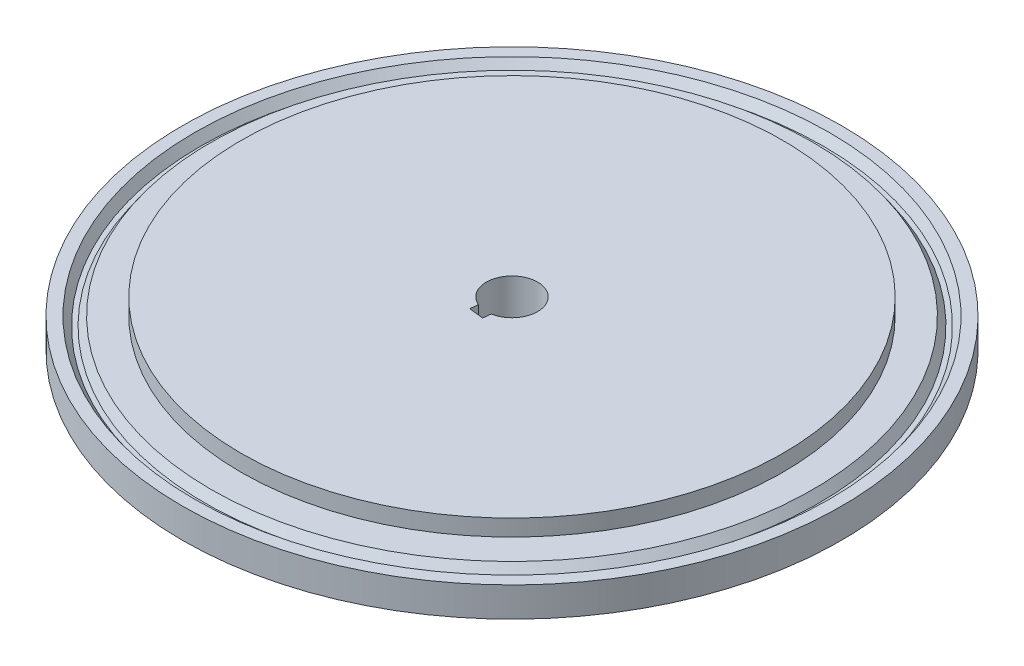
ISO-10303-21;
HEADER;
FILE_DESCRIPTION(('STEP AP214'),'2;1');
FILE_NAME('part.step','',(''),(''),'','','');
FILE_SCHEMA(('AUTOMOTIVE_DESIGN { 1 0 10303 214 1 1 1 1 }'));
ENDSEC;
DATA;
#1=APPLICATION_CONTEXT('core data for automotive mechanical design processes');
#2=APPLICATION_PROTOCOL_DEFINITION('international standard','automotive_design',2000,#1);
#3=PRODUCT_CONTEXT('',#1,'mechanical');
#4=PRODUCT('Part','Part','',(#3));
#5=PRODUCT_RELATED_PRODUCT_CATEGORY('part','',(#4));
#6=PRODUCT_DEFINITION_FORMATION('','',#4);
#7=PRODUCT_DEFINITION_CONTEXT('part definition',#1,'design');
#8=PRODUCT_DEFINITION('design','',#6,#7);
#9=PRODUCT_DEFINITION_SHAPE('','',#8);
#10=(LENGTH_UNIT() NAMED_UNIT(*) SI_UNIT(.MILLI.,.METRE.));
#11=(NAMED_UNIT(*) PLANE_ANGLE_UNIT() SI_UNIT($,.RADIAN.));
#12=(NAMED_UNIT(*) SI_UNIT($,.STERADIAN.) SOLID_ANGLE_UNIT());
#13=UNCERTAINTY_MEASURE_WITH_UNIT(LENGTH_MEASURE(1.E-05),#10,'distance_accuracy_value','');
#14=(GEOMETRIC_REPRESENTATION_CONTEXT(3) GLOBAL_UNCERTAINTY_ASSIGNED_CONTEXT((#13)) GLOBAL_UNIT_ASSIGNED_CONTEXT((#10,
#11,#12)) REPRESENTATION_CONTEXT('',''));
#15=CARTESIAN_POINT('',(0.,0.,0.));
#16=DIRECTION('',(0.,0.,1.));
#17=DIRECTION('',(1.,0.,0.));
#18=AXIS2_PLACEMENT_3D('',#15,#16,#17);
#19=CARTESIAN_POINT('',(0.,12.6,0.));
#20=DIRECTION('',(0.,-1.,0.));
#21=DIRECTION('',(0.,0.,-1.));
#22=AXIS2_PLACEMENT_3D('',#19,#20,#21);
#23=CYLINDRICAL_SURFACE('',#22,90.);
#24=CARTESIAN_POINT('',(0.,0.,0.));
#25=DIRECTION('',(0.,1.,0.));
#26=DIRECTION('',(0.,0.,1.));
#27=AXIS2_PLACEMENT_3D('',#24,#25,#26);
#28=CIRCLE('',#27,90.);
#29=CARTESIAN_POINT('',(0.,0.,90.));
#30=VERTEX_POINT('',#29);
#31=EDGE_CURVE('E11',#30,#30,#28,.T.);
#32=ORIENTED_EDGE('',*,*,#31,.T.);
#33=EDGE_LOOP('',(#32));
#34=FACE_BOUND('',#33,.T.);
#35=CARTESIAN_POINT('',(0.,8.1,0.));
#36=DIRECTION('',(0.,1.,0.));
#37=DIRECTION('',(0.,0.,1.));
#38=AXIS2_PLACEMENT_3D('',#35,#36,#37);
#39=CIRCLE('',#38,90.);
#40=CARTESIAN_POINT('',(0.,8.1,90.));
#41=VERTEX_POINT('',#40);
#42=EDGE_CURVE('E125',#41,#41,#39,.T.);
#43=ORIENTED_EDGE('',*,*,#42,.F.);
#44=EDGE_LOOP('',(#43));
#45=FACE_BOUND('',#44,.T.);
#46=ADVANCED_FACE('F31',(#34,#45),#23,.T.);
#47=CARTESIAN_POINT('',(0.,12.6,0.));
#48=DIRECTION('',(0.,1.,0.));
#49=DIRECTION('',(0.,0.,1.));
#50=AXIS2_PLACEMENT_3D('',#47,#48,#49);
#51=PLANE('',#50);
#52=CARTESIAN_POINT('',(0.,12.6,0.));
#53=DIRECTION('',(0.,1.,0.));
#54=DIRECTION('',(0.,0.,1.));
#55=AXIS2_PLACEMENT_3D('',#52,#53,#54);
#56=CIRCLE('',#55,7.00000000000003);
#57=CARTESIAN_POINT('',(1.23356864848454,12.6,6.8904505215172));
#58=VERTEX_POINT('',#57);
#59=CARTESIAN_POINT('',(-2.74109948066671,12.6,6.44099166565903));
#60=VERTEX_POINT('',#59);
#61=EDGE_CURVE('E39',#58,#60,#56,.T.);
#62=ORIENTED_EDGE('',*,*,#61,.F.);
#63=DIRECTION('',(0.112364713964542,0.,-0.993667032287812));
#64=VECTOR('',#63,1.);
#65=CARTESIAN_POINT('',(1.98733406457565,12.6,0.224729427929087));
#66=LINE('',#65,#64);
#67=CARTESIAN_POINT('',(0.992906345989446,12.6,9.01868266367626));
#68=VERTEX_POINT('',#67);
#69=EDGE_CURVE('E98',#68,#58,#66,.T.);
#70=ORIENTED_EDGE('',*,*,#69,.F.);
#71=DIRECTION('',(0.993667032287812,0.,0.112364713964542));
#72=VECTOR('',#71,1.);
#73=CARTESIAN_POINT('',(-0.994427718586202,12.6,8.79395323574717));
#74=LINE('',#73,#72);
#75=CARTESIAN_POINT('',(-2.9817617831618,12.6,8.56922380781809));
#76=VERTEX_POINT('',#75);
#77=EDGE_CURVE('E79',#76,#68,#74,.T.);
#78=ORIENTED_EDGE('',*,*,#77,.F.);
#79=DIRECTION('',(-0.112364713964542,0.,0.993667032287812));
#80=VECTOR('',#79,1.);
#81=CARTESIAN_POINT('',(-1.9873340645756,12.6,-0.224729427929082));
#82=LINE('',#81,#80);
#83=EDGE_CURVE('E103',#60,#76,#82,.T.);
#84=ORIENTED_EDGE('',*,*,#83,.F.);
#85=EDGE_LOOP('',(#62,#70,#78,#84));
#86=FACE_BOUND('',#85,.T.);
#87=CARTESIAN_POINT('',(0.,12.6,0.));
#88=DIRECTION('',(0.,1.,0.));
#89=DIRECTION('',(0.,0.,1.));
#90=AXIS2_PLACEMENT_3D('',#87,#88,#89);
#91=CIRCLE('',#90,74.);
#92=CARTESIAN_POINT('',(0.,12.6,74.));
#93=VERTEX_POINT('',#92);
#94=EDGE_CURVE('E131',#93,#93,#91,.T.);
#95=ORIENTED_EDGE('',*,*,#94,.T.);
#96=EDGE_LOOP('',(#95));
#97=FACE_BOUND('',#96,.T.);
#98=ADVANCED_FACE('F161',(#86,#97),#51,.T.);
#99=CARTESIAN_POINT('',(0.,0.,0.));
#100=DIRECTION('',(0.,1.,0.));
#101=DIRECTION('',(0.,0.,1.));
#102=AXIS2_PLACEMENT_3D('',#99,#100,#101);
#103=PLANE('',#102);
#104=CARTESIAN_POINT('',(0.,0.,0.));
#105=DIRECTION('',(0.,1.,0.));
#106=DIRECTION('',(0.,0.,1.));
#107=AXIS2_PLACEMENT_3D('',#104,#105,#106);
#108=CIRCLE('',#107,63.6238804949366);
#109=CARTESIAN_POINT('',(0.,0.,63.6238804949366));
#110=VERTEX_POINT('',#109);
#111=EDGE_CURVE('E108',#110,#110,#108,.F.);
#112=ORIENTED_EDGE('',*,*,#111,.T.);
#113=EDGE_LOOP('',(#112));
#114=FACE_BOUND('',#113,.T.);
#115=DIRECTION('',(-0.112364713964542,0.,0.993667032287812));
#116=VECTOR('',#115,1.);
#117=CARTESIAN_POINT('',(0.992906345989446,0.,9.01868266367626));
#118=LINE('',#117,#116);
#119=CARTESIAN_POINT('',(1.23356864848454,0.,6.8904505215172));
#120=VERTEX_POINT('',#119);
#121=CARTESIAN_POINT('',(0.992906345989446,0.,9.01868266367626));
#122=VERTEX_POINT('',#121);
#123=EDGE_CURVE('E85',#120,#122,#118,.T.);
#124=ORIENTED_EDGE('',*,*,#123,.F.);
#125=CARTESIAN_POINT('',(0.,0.,0.));
#126=DIRECTION('',(0.,-1.,0.));
#127=DIRECTION('',(0.,0.,-1.));
#128=AXIS2_PLACEMENT_3D('',#125,#126,#127);
#129=CIRCLE('',#128,7.00000000000003);
#130=CARTESIAN_POINT('',(-2.74109948066671,0.,6.44099166565903));
#131=VERTEX_POINT('',#130);
#132=EDGE_CURVE('E55',#131,#120,#129,.T.);
#133=ORIENTED_EDGE('',*,*,#132,.F.);
#134=DIRECTION('',(0.112364713964542,0.,-0.993667032287812));
#135=VECTOR('',#134,1.);
#136=CARTESIAN_POINT('',(-2.74109948066671,0.,6.44099166565903));
#137=LINE('',#136,#135);
#138=CARTESIAN_POINT('',(-2.9817617831618,0.,8.56922380781809));
#139=VERTEX_POINT('',#138);
#140=EDGE_CURVE('E91',#139,#131,#137,.T.);
#141=ORIENTED_EDGE('',*,*,#140,.F.);
#142=DIRECTION('',(-0.993667032287812,0.,-0.112364713964542));
#143=VECTOR('',#142,1.);
#144=CARTESIAN_POINT('',(-2.9817617831618,0.,8.56922380781809));
#145=LINE('',#144,#143);
#146=EDGE_CURVE('E76',#122,#139,#145,.T.);
#147=ORIENTED_EDGE('',*,*,#146,.F.);
#148=EDGE_LOOP('',(#124,#133,#141,#147));
#149=FACE_BOUND('',#148,.T.);
#150=ADVANCED_FACE('F89',(#114,#149),#103,.F.);
#151=CARTESIAN_POINT('',(0.,0.,0.));
#152=DIRECTION('',(0.,1.,0.));
#153=DIRECTION('',(0.,0.,1.));
#154=AXIS2_PLACEMENT_3D('',#151,#152,#153);
#155=CIRCLE('',#154,77.640556445342);
#156=CARTESIAN_POINT('',(0.,0.,77.640556445342));
#157=VERTEX_POINT('',#156);
#158=EDGE_CURVE('E106',#157,#157,#155,.T.);
#159=ORIENTED_EDGE('',*,*,#158,.T.);
#160=EDGE_LOOP('',(#159));
#161=FACE_BOUND('',#160,.T.);
#162=ORIENTED_EDGE('',*,*,#31,.F.);
#163=EDGE_LOOP('',(#162));
#164=FACE_BOUND('',#163,.T.);
#165=ADVANCED_FACE('F210',(#161,#164),#103,.F.);
#166=CARTESIAN_POINT('',(0.,32.,0.));
#167=DIRECTION('',(0.,-1.,0.));
#168=DIRECTION('',(0.,0.,-1.));
#169=AXIS2_PLACEMENT_3D('',#166,#167,#168);
#170=CYLINDRICAL_SURFACE('',#169,7.00000000000003);
#171=ORIENTED_EDGE('',*,*,#61,.T.);
#172=DIRECTION('',(0.,-1.,0.));
#173=VECTOR('',#172,1.);
#174=CARTESIAN_POINT('',(-2.74109948066671,32.,6.44099166565903));
#175=LINE('',#174,#173);
#176=EDGE_CURVE('E96',#60,#131,#175,.T.);
#177=ORIENTED_EDGE('',*,*,#176,.T.);
#178=ORIENTED_EDGE('',*,*,#132,.T.);
#179=DIRECTION('',(0.,-1.,0.));
#180=VECTOR('',#179,1.);
#181=CARTESIAN_POINT('',(1.23356864848454,32.,6.8904505215172));
#182=LINE('',#181,#180);
#183=EDGE_CURVE('E82',#58,#120,#182,.T.);
#184=ORIENTED_EDGE('',*,*,#183,.F.);
#185=EDGE_LOOP('',(#171,#177,#178,#184));
#186=FACE_BOUND('',#185,.T.);
#187=ADVANCED_FACE('F203',(#186),#170,.F.);
#188=CARTESIAN_POINT('',(-2.74109948066671,32.,6.44099166565903));
#189=DIRECTION('',(-0.993667032287812,0.,-0.112364713964542));
#190=DIRECTION('',(-0.112364713964542,0.,0.993667032287812));
#191=AXIS2_PLACEMENT_3D('',#188,#189,#190);
#192=PLANE('',#191);
#193=ORIENTED_EDGE('',*,*,#83,.T.);
#194=DIRECTION('',(0.,-1.,0.));
#195=VECTOR('',#194,1.);
#196=CARTESIAN_POINT('',(-2.9817617831618,32.,8.56922380781809));
#197=LINE('',#196,#195);
#198=EDGE_CURVE('E81',#76,#139,#197,.T.);
#199=ORIENTED_EDGE('',*,*,#198,.T.);
#200=ORIENTED_EDGE('',*,*,#140,.T.);
#201=ORIENTED_EDGE('',*,*,#176,.F.);
#202=EDGE_LOOP('',(#193,#199,#200,#201));
#203=FACE_BOUND('',#202,.T.);
#204=ADVANCED_FACE('F200',(#203),#192,.F.);
#205=CARTESIAN_POINT('',(-2.9817617831618,32.,8.56922380781809));
#206=DIRECTION('',(-0.112364713964542,0.,0.993667032287812));
#207=DIRECTION('',(0.993667032287812,0.,0.112364713964542));
#208=AXIS2_PLACEMENT_3D('',#205,#206,#207);
#209=PLANE('',#208);
#210=ORIENTED_EDGE('',*,*,#77,.T.);
#211=DIRECTION('',(0.,-1.,0.));
#212=VECTOR('',#211,1.);
#213=CARTESIAN_POINT('',(0.992906345989446,32.,9.01868266367626));
#214=LINE('',#213,#212);
#215=EDGE_CURVE('E47',#68,#122,#214,.T.);
#216=ORIENTED_EDGE('',*,*,#215,.T.);
#217=ORIENTED_EDGE('',*,*,#146,.T.);
#218=ORIENTED_EDGE('',*,*,#198,.F.);
#219=EDGE_LOOP('',(#210,#216,#217,#218));
#220=FACE_BOUND('',#219,.T.);
#221=ADVANCED_FACE('F73',(#220),#209,.F.);
#222=CARTESIAN_POINT('',(0.992906345989446,32.,9.01868266367626));
#223=DIRECTION('',(0.993667032287812,0.,0.112364713964542));
#224=DIRECTION('',(0.112364713964542,0.,-0.993667032287812));
#225=AXIS2_PLACEMENT_3D('',#222,#223,#224);
#226=PLANE('',#225);
#227=ORIENTED_EDGE('',*,*,#69,.T.);
#228=ORIENTED_EDGE('',*,*,#183,.T.);
#229=ORIENTED_EDGE('',*,*,#123,.T.);
#230=ORIENTED_EDGE('',*,*,#215,.F.);
#231=EDGE_LOOP('',(#227,#228,#229,#230));
#232=FACE_BOUND('',#231,.T.);
#233=ADVANCED_FACE('F86',(#232),#226,.F.);
#234=CARTESIAN_POINT('',(0.,5.47840413366214,0.));
#235=DIRECTION('',(0.,1.,0.));
#236=DIRECTION('',(0.,0.,1.));
#237=AXIS2_PLACEMENT_3D('',#234,#235,#236);
#238=CONICAL_SURFACE('',#237,68.8638849919393,0.763159756218278);
#239=CARTESIAN_POINT('',(0.,5.47840413366214,0.));
#240=DIRECTION('',(0.,-1.,0.));
#241=DIRECTION('',(0.,0.,-1.));
#242=AXIS2_PLACEMENT_3D('',#239,#240,#241);
#243=CIRCLE('',#242,68.8638849919393);
#244=CARTESIAN_POINT('',(0.,5.47840413366214,-68.8638849919393));
#245=VERTEX_POINT('',#244);
#246=EDGE_CURVE('E116',#245,#245,#243,.T.);
#247=ORIENTED_EDGE('',*,*,#246,.T.);
#248=EDGE_LOOP('',(#247));
#249=FACE_BOUND('',#248,.T.);
#250=ORIENTED_EDGE('',*,*,#111,.F.);
#251=EDGE_LOOP('',(#250));
#252=FACE_BOUND('',#251,.T.);
#253=ADVANCED_FACE('F191',(#249,#252),#238,.T.);
#254=CARTESIAN_POINT('',(0.,-0.267847704786495,0.));
#255=DIRECTION('',(0.,-1.,0.));
#256=DIRECTION('',(0.,0.,-1.));
#257=AXIS2_PLACEMENT_3D('',#254,#255,#256);
#258=CONICAL_SURFACE('',#257,77.8967484208425,0.763159756218278);
#259=CARTESIAN_POINT('',(0.,5.47840413366214,0.));
#260=DIRECTION('',(0.,-1.,0.));
#261=DIRECTION('',(0.,0.,-1.));
#262=AXIS2_PLACEMENT_3D('',#259,#260,#261);
#263=CIRCLE('',#262,72.4005519483392);
#264=CARTESIAN_POINT('',(0.,5.47840413366214,-72.4005519483392));
#265=VERTEX_POINT('',#264);
#266=EDGE_CURVE('E109',#265,#265,#263,.T.);
#267=ORIENTED_EDGE('',*,*,#266,.F.);
#268=EDGE_LOOP('',(#267));
#269=FACE_BOUND('',#268,.T.);
#270=ORIENTED_EDGE('',*,*,#158,.F.);
#271=EDGE_LOOP('',(#270));
#272=FACE_BOUND('',#271,.T.);
#273=ADVANCED_FACE('F185',(#269,#272),#258,.F.);
#274=CARTESIAN_POINT('',(68.8638849919393,5.47840413366215,0.));
#275=DIRECTION('',(0.,1.,0.));
#276=DIRECTION('',(0.,0.,1.));
#277=AXIS2_PLACEMENT_3D('',#274,#275,#276);
#278=PLANE('',#277);
#279=ORIENTED_EDGE('',*,*,#246,.F.);
#280=EDGE_LOOP('',(#279));
#281=FACE_BOUND('',#280,.T.);
#282=ORIENTED_EDGE('',*,*,#266,.T.);
#283=EDGE_LOOP('',(#282));
#284=FACE_BOUND('',#283,.T.);
#285=ADVANCED_FACE('F180',(#281,#284),#278,.F.);
#286=CARTESIAN_POINT('',(0.,8.1,0.));
#287=DIRECTION('',(0.,1.,0.));
#288=DIRECTION('',(0.,0.,1.));
#289=AXIS2_PLACEMENT_3D('',#286,#287,#288);
#290=PLANE('',#289);
#291=CARTESIAN_POINT('',(0.,8.1,0.));
#292=DIRECTION('',(0.,1.,0.));
#293=DIRECTION('',(0.,0.,1.));
#294=AXIS2_PLACEMENT_3D('',#291,#292,#293);
#295=CIRCLE('',#294,74.);
#296=CARTESIAN_POINT('',(0.,8.1,74.));
#297=VERTEX_POINT('',#296);
#298=EDGE_CURVE('E134',#297,#297,#295,.T.);
#299=ORIENTED_EDGE('',*,*,#298,.F.);
#300=EDGE_LOOP('',(#299));
#301=FACE_BOUND('',#300,.T.);
#302=CARTESIAN_POINT('',(0.,8.1,0.));
#303=DIRECTION('',(0.,1.,0.));
#304=DIRECTION('',(0.,0.,1.));
#305=AXIS2_PLACEMENT_3D('',#302,#303,#304);
#306=CIRCLE('',#305,82.1564681015949);
#307=CARTESIAN_POINT('',(0.,8.1,82.1564681015949));
#308=VERTEX_POINT('',#307);
#309=EDGE_CURVE('E34',#308,#308,#306,.T.);
#310=ORIENTED_EDGE('',*,*,#309,.T.);
#311=EDGE_LOOP('',(#310));
#312=FACE_BOUND('',#311,.T.);
#313=ADVANCED_FACE('F141',(#301,#312),#290,.T.);
#314=CARTESIAN_POINT('',(0.,8.1,0.));
#315=DIRECTION('',(0.,1.,0.));
#316=DIRECTION('',(0.,0.,1.));
#317=AXIS2_PLACEMENT_3D('',#314,#315,#316);
#318=CYLINDRICAL_SURFACE('',#317,74.);
#319=ORIENTED_EDGE('',*,*,#298,.T.);
#320=EDGE_LOOP('',(#319));
#321=FACE_BOUND('',#320,.T.);
#322=ORIENTED_EDGE('',*,*,#94,.F.);
#323=EDGE_LOOP('',(#322));
#324=FACE_BOUND('',#323,.T.);
#325=ADVANCED_FACE('F173',(#321,#324),#318,.T.);
#326=CARTESIAN_POINT('',(0.,8.1,0.));
#327=DIRECTION('',(0.,1.,0.));
#328=DIRECTION('',(0.,0.,1.));
#329=AXIS2_PLACEMENT_3D('',#326,#327,#328);
#330=CIRCLE('',#329,86.709289028532);
#331=CARTESIAN_POINT('',(0.,8.1,86.709289028532));
#332=VERTEX_POINT('',#331);
#333=EDGE_CURVE('E128',#332,#332,#330,.F.);
#334=ORIENTED_EDGE('',*,*,#333,.T.);
#335=EDGE_LOOP('',(#334));
#336=FACE_BOUND('',#335,.T.);
#337=ORIENTED_EDGE('',*,*,#42,.T.);
#338=EDGE_LOOP('',(#337));
#339=FACE_BOUND('',#338,.T.);
#340=ADVANCED_FACE('F155',(#336,#339),#290,.T.);
#341=CARTESIAN_POINT('',(0.,5.70041166103368,0.));
#342=DIRECTION('',(0.,1.,0.));
#343=DIRECTION('',(0.,0.,1.));
#344=AXIS2_PLACEMENT_3D('',#341,#342,#343);
#345=CONICAL_SURFACE('',#344,85.0628425496033,0.601361256829481);
#346=CARTESIAN_POINT('',(0.,5.70041166103368,0.));
#347=DIRECTION('',(0.,-1.,0.));
#348=DIRECTION('',(0.,0.,-1.));
#349=AXIS2_PLACEMENT_3D('',#346,#347,#348);
#350=CIRCLE('',#349,85.0628425496033);
#351=CARTESIAN_POINT('',(0.,5.70041166103368,-85.0628425496033));
#352=VERTEX_POINT('',#351);
#353=EDGE_CURVE('E119',#352,#352,#350,.T.);
#354=ORIENTED_EDGE('',*,*,#353,.T.);
#355=EDGE_LOOP('',(#354));
#356=FACE_BOUND('',#355,.T.);
#357=ORIENTED_EDGE('',*,*,#333,.F.);
#358=EDGE_LOOP('',(#357));
#359=FACE_BOUND('',#358,.T.);
#360=ADVANCED_FACE('F146',(#356,#359),#345,.F.);
#361=CARTESIAN_POINT('',(0.,9.42306338805129,0.));
#362=DIRECTION('',(0.,-1.,0.));
#363=DIRECTION('',(0.,0.,-1.));
#364=AXIS2_PLACEMENT_3D('',#361,#362,#363);
#365=CONICAL_SURFACE('',#364,81.2486652833853,0.601361256829473);
#366=CARTESIAN_POINT('',(0.,5.70041166103368,0.));
#367=DIRECTION('',(0.,-1.,0.));
#368=DIRECTION('',(0.,0.,-1.));
#369=AXIS2_PLACEMENT_3D('',#366,#367,#368);
#370=CIRCLE('',#369,83.8029145805236);
#371=CARTESIAN_POINT('',(0.,5.70041166103368,-83.8029145805236));
#372=VERTEX_POINT('',#371);
#373=EDGE_CURVE('E122',#372,#372,#370,.T.);
#374=ORIENTED_EDGE('',*,*,#373,.F.);
#375=EDGE_LOOP('',(#374));
#376=FACE_BOUND('',#375,.T.);
#377=ORIENTED_EDGE('',*,*,#309,.F.);
#378=EDGE_LOOP('',(#377));
#379=FACE_BOUND('',#378,.T.);
#380=ADVANCED_FACE('F143',(#376,#379),#365,.T.);
#381=CARTESIAN_POINT('',(83.8029145805236,5.70041166103368,0.));
#382=DIRECTION('',(0.,-1.,0.));
#383=DIRECTION('',(0.,0.,-1.));
#384=AXIS2_PLACEMENT_3D('',#381,#382,#383);
#385=PLANE('',#384);
#386=ORIENTED_EDGE('',*,*,#353,.F.);
#387=EDGE_LOOP('',(#386));
#388=FACE_BOUND('',#387,.T.);
#389=ORIENTED_EDGE('',*,*,#373,.T.);
#390=EDGE_LOOP('',(#389));
#391=FACE_BOUND('',#390,.T.);
#392=ADVANCED_FACE('F145',(#388,#391),#385,.F.);
#393=CLOSED_SHELL('',(#46,#98,#150,#165,#187,#204,#221,#233,#253,#273,#285,#313,#325,#340,#360,
#380,#392));
#394=MANIFOLD_SOLID_BREP('B2',#393);
#395=ADVANCED_BREP_SHAPE_REPRESENTATION('',(#18,#394),#14);
#396=SHAPE_DEFINITION_REPRESENTATION(#9,#395);
ENDSEC;
END-ISO-10303-21;
